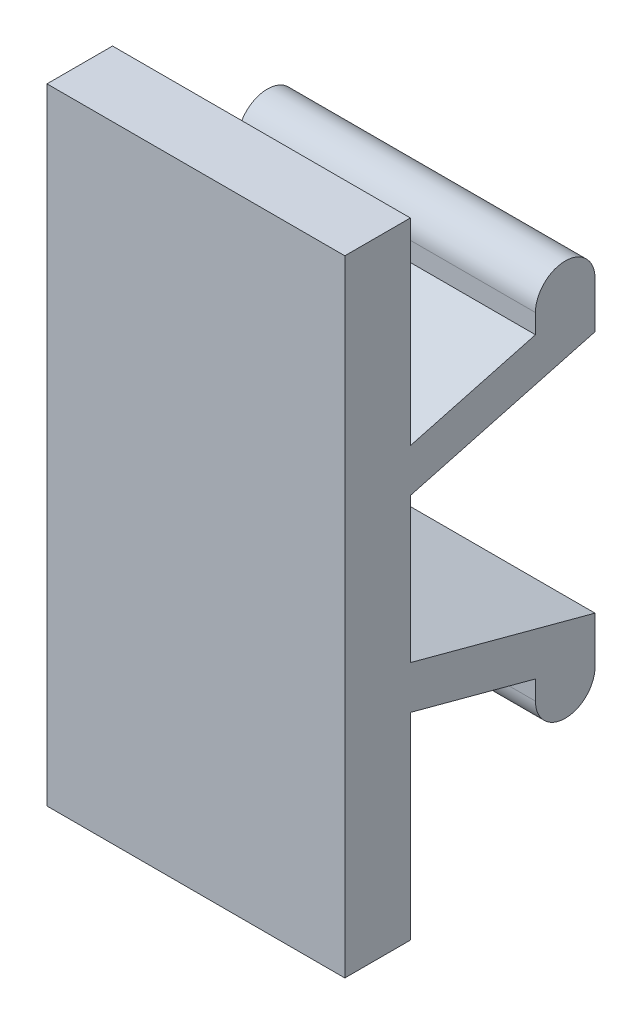
ISO-10303-21;
HEADER;
FILE_DESCRIPTION(('STEP AP214'),'2;1');
FILE_NAME('part.step','',(''),(''),'','','');
FILE_SCHEMA(('AUTOMOTIVE_DESIGN { 1 0 10303 214 1 1 1 1 }'));
ENDSEC;
DATA;
#1=APPLICATION_CONTEXT('core data for automotive mechanical design processes');
#2=APPLICATION_PROTOCOL_DEFINITION('international standard','automotive_design',2000,#1);
#3=PRODUCT_CONTEXT('',#1,'mechanical');
#4=PRODUCT('Part','Part','',(#3));
#5=PRODUCT_RELATED_PRODUCT_CATEGORY('part','',(#4));
#6=PRODUCT_DEFINITION_FORMATION('','',#4);
#7=PRODUCT_DEFINITION_CONTEXT('part definition',#1,'design');
#8=PRODUCT_DEFINITION('design','',#6,#7);
#9=PRODUCT_DEFINITION_SHAPE('','',#8);
#10=(LENGTH_UNIT() NAMED_UNIT(*) SI_UNIT(.MILLI.,.METRE.));
#11=(NAMED_UNIT(*) PLANE_ANGLE_UNIT() SI_UNIT($,.RADIAN.));
#12=(NAMED_UNIT(*) SI_UNIT($,.STERADIAN.) SOLID_ANGLE_UNIT());
#13=UNCERTAINTY_MEASURE_WITH_UNIT(LENGTH_MEASURE(1.E-05),#10,'distance_accuracy_value','');
#14=(GEOMETRIC_REPRESENTATION_CONTEXT(3) GLOBAL_UNCERTAINTY_ASSIGNED_CONTEXT((#13)) GLOBAL_UNIT_ASSIGNED_CONTEXT((#10,
#11,#12)) REPRESENTATION_CONTEXT('',''));
#15=CARTESIAN_POINT('',(0.,0.,0.));
#16=DIRECTION('',(0.,0.,1.));
#17=DIRECTION('',(1.,0.,0.));
#18=AXIS2_PLACEMENT_3D('',#15,#16,#17);
#19=CARTESIAN_POINT('',(-4.21537804662364E-13,-70.2839421184865,-13.5703289008152));
#20=DIRECTION('',(-1.,0.,0.));
#21=DIRECTION('',(0.,-0.707106781186548,-0.707106781186547));
#22=AXIS2_PLACEMENT_3D('',#19,#20,#21);
#23=PLANE('',#22);
#24=DIRECTION('',(0.,-0.258819045104797,-0.965925826288459));
#25=VECTOR('',#24,1.);
#26=CARTESIAN_POINT('',(-4.21537804662364E-13,-15.7645761699215,-68.0896948493802));
#27=LINE('',#26,#25);
#28=CARTESIAN_POINT('',(-4.21537804662364E-13,3.31064507456784,3.10000000000041));
#29=VERTEX_POINT('',#28);
#30=CARTESIAN_POINT('',(-4.21537804662364E-13,2.74795177045711,1.00000000000012));
#31=VERTEX_POINT('',#30);
#32=EDGE_CURVE('E205',#29,#31,#27,.T.);
#33=ORIENTED_EDGE('',*,*,#32,.F.);
#34=DIRECTION('',(0.,-1.,0.));
#35=VECTOR('',#34,1.);
#36=CARTESIAN_POINT('',(-4.21537804662364E-13,-53.6136132176709,3.10000000000043));
#37=LINE('',#36,#35);
#38=CARTESIAN_POINT('',(-4.21537804662364E-13,-4.92661467177413E-13,3.10000000000041));
#39=VERTEX_POINT('',#38);
#40=EDGE_CURVE('E283',#29,#39,#37,.T.);
#41=ORIENTED_EDGE('',*,*,#40,.T.);
#42=DIRECTION('',(0.,0.,1.));
#43=VECTOR('',#42,1.);
#44=CARTESIAN_POINT('',(-4.21537804662364E-13,-7.49400541621981E-13,-83.854271019301));
#45=LINE('',#44,#43);
#46=CARTESIAN_POINT('',(-4.21537804662364E-13,-4.85722573273506E-13,4.20000000000026));
#47=VERTEX_POINT('',#46);
#48=EDGE_CURVE('E296',#39,#47,#45,.T.);
#49=ORIENTED_EDGE('',*,*,#48,.T.);
#50=DIRECTION('',(0.,1.,0.));
#51=VECTOR('',#50,1.);
#52=CARTESIAN_POINT('',(-4.21537804662364E-13,-52.513613217671,4.20000000000034));
#53=LINE('',#52,#51);
#54=CARTESIAN_POINT('',(-4.21537804662364E-13,10.4999999999994,4.20000000000025));
#55=VERTEX_POINT('',#54);
#56=EDGE_CURVE('E195',#47,#55,#53,.T.);
#57=ORIENTED_EDGE('',*,*,#56,.T.);
#58=DIRECTION('',(0.,0.,1.));
#59=VECTOR('',#58,1.);
#60=CARTESIAN_POINT('',(-4.21537804662364E-13,10.4999999999996,-94.3542710193014));
#61=LINE('',#60,#59);
#62=CARTESIAN_POINT('',(-4.21537804662364E-13,10.4999999999994,3.10000000000041));
#63=VERTEX_POINT('',#62);
#64=EDGE_CURVE('E187',#63,#55,#61,.T.);
#65=ORIENTED_EDGE('',*,*,#64,.F.);
#66=DIRECTION('',(0.,-1.,0.));
#67=VECTOR('',#66,1.);
#68=CARTESIAN_POINT('',(-4.21537804662364E-13,-53.6136132176709,3.10000000000043));
#69=LINE('',#68,#67);
#70=CARTESIAN_POINT('',(-4.21537804662364E-13,7.18935492542956,3.1000000000004));
#71=VERTEX_POINT('',#70);
#72=EDGE_CURVE('E154',#63,#71,#69,.T.);
#73=ORIENTED_EDGE('',*,*,#72,.T.);
#74=DIRECTION('',(0.,-0.258819045105016,0.9659258262884));
#75=VECTOR('',#74,1.);
#76=CARTESIAN_POINT('',(-4.21537804662364E-13,-5.65982413375175,51.0537890839195));
#77=LINE('',#76,#75);
#78=CARTESIAN_POINT('',(-4.21537804662364E-13,7.75204822954077,1.00000000000005));
#79=VERTEX_POINT('',#78);
#80=EDGE_CURVE('E133',#79,#71,#77,.T.);
#81=ORIENTED_EDGE('',*,*,#80,.F.);
#82=DIRECTION('',(0.,-1.,0.));
#83=VECTOR('',#82,1.);
#84=CARTESIAN_POINT('',(-4.21537804662364E-13,-55.7136132176712,1.00000000000013));
#85=LINE('',#84,#83);
#86=CARTESIAN_POINT('',(-4.21537804662364E-13,8.07499999999913,1.00000000000006));
#87=VERTEX_POINT('',#86);
#88=EDGE_CURVE('E146',#87,#79,#85,.T.);
#89=ORIENTED_EDGE('',*,*,#88,.F.);
#90=CARTESIAN_POINT('',(-4.21537804662364E-13,8.07499999999919,0.500000000000085));
#91=DIRECTION('',(-1.,0.,0.));
#92=DIRECTION('',(0.,0.,-1.));
#93=AXIS2_PLACEMENT_3D('',#90,#91,#92);
#94=CIRCLE('',#93,0.500000000000199);
#95=CARTESIAN_POINT('',(-4.21537804662364E-13,8.07499999999913,-1.64798730217797E-13));
#96=VERTEX_POINT('',#95);
#97=EDGE_CURVE('E150',#87,#96,#94,.T.);
#98=ORIENTED_EDGE('',*,*,#97,.T.);
#99=DIRECTION('',(0.,-1.,0.));
#100=VECTOR('',#99,1.);
#101=CARTESIAN_POINT('',(-4.21537804662364E-13,-56.7136132176712,1.28369537222284E-13));
#102=LINE('',#101,#100);
#103=CARTESIAN_POINT('',(-4.21537804662364E-13,7.29530409568387,1.196959198424E-13));
#104=VERTEX_POINT('',#103);
#105=EDGE_CURVE('E212',#96,#104,#102,.T.);
#106=ORIENTED_EDGE('',*,*,#105,.T.);
#107=DIRECTION('',(0.,-0.258819045104021,0.965925826288666));
#108=VECTOR('',#107,1.);
#109=CARTESIAN_POINT('',(-4.21537804662364E-13,-6.23137174035895,50.4822414773123));
#110=LINE('',#109,#108);
#111=CARTESIAN_POINT('',(-4.21537804662364E-13,6.46466159914211,3.10000000000041));
#112=VERTEX_POINT('',#111);
#113=EDGE_CURVE('E11',#104,#112,#110,.T.);
#114=ORIENTED_EDGE('',*,*,#113,.T.);
#115=DIRECTION('',(0.,-1.,0.));
#116=VECTOR('',#115,1.);
#117=CARTESIAN_POINT('',(-4.21537804662364E-13,-53.6136132176709,3.10000000000043));
#118=LINE('',#117,#116);
#119=CARTESIAN_POINT('',(-4.21537804662364E-13,4.03533840085481,3.10000000000033));
#120=VERTEX_POINT('',#119);
#121=EDGE_CURVE('E261',#112,#120,#118,.T.);
#122=ORIENTED_EDGE('',*,*,#121,.T.);
#123=DIRECTION('',(0.,-0.258819045103512,-0.965925826288803));
#124=VECTOR('',#123,1.);
#125=CARTESIAN_POINT('',(-4.21537804662364E-13,-15.1930285631926,-68.6612424561092));
#126=LINE('',#125,#124);
#127=CARTESIAN_POINT('',(-4.21537804662364E-13,3.20469590431488,0.));
#128=VERTEX_POINT('',#127);
#129=EDGE_CURVE('E260',#120,#128,#126,.T.);
#130=ORIENTED_EDGE('',*,*,#129,.T.);
#131=DIRECTION('',(0.,-1.,0.));
#132=VECTOR('',#131,1.);
#133=CARTESIAN_POINT('',(-4.21537804662364E-13,-56.7136132176712,1.28369537222284E-13));
#134=LINE('',#133,#132);
#135=CARTESIAN_POINT('',(-4.21537804662364E-13,2.42499999999941,1.16226472890446E-13));
#136=VERTEX_POINT('',#135);
#137=EDGE_CURVE('E200',#128,#136,#134,.T.);
#138=ORIENTED_EDGE('',*,*,#137,.T.);
#139=CARTESIAN_POINT('',(-4.21537804662364E-13,2.42499999999933,0.500000000000089));
#140=DIRECTION('',(-1.,0.,0.));
#141=DIRECTION('',(0.,0.,-1.));
#142=AXIS2_PLACEMENT_3D('',#139,#140,#141);
#143=CIRCLE('',#142,0.5);
#144=CARTESIAN_POINT('',(-4.21537804662364E-13,2.4249999999994,1.00000000000005));
#145=VERTEX_POINT('',#144);
#146=EDGE_CURVE('E230',#136,#145,#143,.T.);
#147=ORIENTED_EDGE('',*,*,#146,.T.);
#148=DIRECTION('',(0.,-1.,0.));
#149=VECTOR('',#148,1.);
#150=CARTESIAN_POINT('',(-4.21537804662364E-13,-55.7136132176712,1.00000000000013));
#151=LINE('',#150,#149);
#152=EDGE_CURVE('E307',#31,#145,#151,.T.);
#153=ORIENTED_EDGE('',*,*,#152,.F.);
#154=EDGE_LOOP('',(#33,#41,#49,#57,#65,#73,#81,#89,#98,#106,#114,#122,#130,#138,#147,#153));
#155=FACE_BOUND('',#154,.T.);
#156=ADVANCED_FACE('F16',(#155),#23,.T.);
#157=CARTESIAN_POINT('',(4.9999999999996,-70.2839421184865,-13.5703289008152));
#158=DIRECTION('',(-1.,0.,0.));
#159=DIRECTION('',(0.,-0.707106781186548,-0.707106781186547));
#160=AXIS2_PLACEMENT_3D('',#157,#158,#159);
#161=PLANE('',#160);
#162=DIRECTION('',(0.,-1.,0.));
#163=VECTOR('',#162,1.);
#164=CARTESIAN_POINT('',(4.9999999999996,-55.7136132176712,1.00000000000013));
#165=LINE('',#164,#163);
#166=CARTESIAN_POINT('',(4.9999999999996,2.74795177045711,1.00000000000012));
#167=VERTEX_POINT('',#166);
#168=CARTESIAN_POINT('',(4.9999999999996,2.4249999999994,1.00000000000005));
#169=VERTEX_POINT('',#168);
#170=EDGE_CURVE('E238',#167,#169,#165,.T.);
#171=ORIENTED_EDGE('',*,*,#170,.T.);
#172=CARTESIAN_POINT('',(4.9999999999996,2.42499999999933,0.500000000000089));
#173=DIRECTION('',(-1.,0.,0.));
#174=DIRECTION('',(0.,0.,-1.));
#175=AXIS2_PLACEMENT_3D('',#172,#173,#174);
#176=CIRCLE('',#175,0.5);
#177=CARTESIAN_POINT('',(4.9999999999996,2.42499999999941,1.16226472890446E-13));
#178=VERTEX_POINT('',#177);
#179=EDGE_CURVE('E191',#178,#169,#176,.T.);
#180=ORIENTED_EDGE('',*,*,#179,.F.);
#181=DIRECTION('',(0.,-1.,0.));
#182=VECTOR('',#181,1.);
#183=CARTESIAN_POINT('',(4.9999999999996,-56.7136132176712,1.28369537222284E-13));
#184=LINE('',#183,#182);
#185=CARTESIAN_POINT('',(4.9999999999996,3.20469590431488,0.));
#186=VERTEX_POINT('',#185);
#187=EDGE_CURVE('E197',#186,#178,#184,.T.);
#188=ORIENTED_EDGE('',*,*,#187,.F.);
#189=DIRECTION('',(0.,-0.258819045103512,-0.965925826288803));
#190=VECTOR('',#189,1.);
#191=CARTESIAN_POINT('',(4.9999999999996,-15.1930285631926,-68.6612424561092));
#192=LINE('',#191,#190);
#193=CARTESIAN_POINT('',(4.9999999999996,4.03533840085481,3.10000000000033));
#194=VERTEX_POINT('',#193);
#195=EDGE_CURVE('E259',#194,#186,#192,.T.);
#196=ORIENTED_EDGE('',*,*,#195,.F.);
#197=DIRECTION('',(0.,-1.,0.));
#198=VECTOR('',#197,1.);
#199=CARTESIAN_POINT('',(4.9999999999996,-53.6136132176709,3.10000000000043));
#200=LINE('',#199,#198);
#201=CARTESIAN_POINT('',(4.9999999999996,6.46466159914211,3.10000000000041));
#202=VERTEX_POINT('',#201);
#203=EDGE_CURVE('E190',#202,#194,#200,.T.);
#204=ORIENTED_EDGE('',*,*,#203,.F.);
#205=DIRECTION('',(0.,-0.258819045104021,0.965925826288666));
#206=VECTOR('',#205,1.);
#207=CARTESIAN_POINT('',(4.9999999999996,-6.23137174035895,50.4822414773123));
#208=LINE('',#207,#206);
#209=CARTESIAN_POINT('',(4.9999999999996,7.29530409568387,1.196959198424E-13));
#210=VERTEX_POINT('',#209);
#211=EDGE_CURVE('E26',#210,#202,#208,.T.);
#212=ORIENTED_EDGE('',*,*,#211,.F.);
#213=DIRECTION('',(0.,-1.,0.));
#214=VECTOR('',#213,1.);
#215=CARTESIAN_POINT('',(4.9999999999996,-56.7136132176712,1.28369537222284E-13));
#216=LINE('',#215,#214);
#217=CARTESIAN_POINT('',(4.9999999999996,8.07499999999913,-1.64798730217797E-13));
#218=VERTEX_POINT('',#217);
#219=EDGE_CURVE('E213',#218,#210,#216,.T.);
#220=ORIENTED_EDGE('',*,*,#219,.F.);
#221=CARTESIAN_POINT('',(4.9999999999996,8.07499999999919,0.500000000000085));
#222=DIRECTION('',(-1.,0.,0.));
#223=DIRECTION('',(0.,0.,-1.));
#224=AXIS2_PLACEMENT_3D('',#221,#222,#223);
#225=CIRCLE('',#224,0.500000000000199);
#226=CARTESIAN_POINT('',(4.9999999999996,8.07499999999913,1.00000000000006));
#227=VERTEX_POINT('',#226);
#228=EDGE_CURVE('E165',#227,#218,#225,.T.);
#229=ORIENTED_EDGE('',*,*,#228,.F.);
#230=DIRECTION('',(0.,-1.,0.));
#231=VECTOR('',#230,1.);
#232=CARTESIAN_POINT('',(4.9999999999996,-55.7136132176712,1.00000000000013));
#233=LINE('',#232,#231);
#234=CARTESIAN_POINT('',(4.9999999999996,7.75204822954077,1.00000000000005));
#235=VERTEX_POINT('',#234);
#236=EDGE_CURVE('E155',#227,#235,#233,.T.);
#237=ORIENTED_EDGE('',*,*,#236,.T.);
#238=DIRECTION('',(0.,-0.258819045105016,0.9659258262884));
#239=VECTOR('',#238,1.);
#240=CARTESIAN_POINT('',(4.9999999999996,-5.65982413375175,51.0537890839195));
#241=LINE('',#240,#239);
#242=CARTESIAN_POINT('',(4.9999999999996,7.18935492542956,3.1000000000004));
#243=VERTEX_POINT('',#242);
#244=EDGE_CURVE('E306',#235,#243,#241,.T.);
#245=ORIENTED_EDGE('',*,*,#244,.T.);
#246=DIRECTION('',(0.,-1.,0.));
#247=VECTOR('',#246,1.);
#248=CARTESIAN_POINT('',(4.9999999999996,-53.6136132176709,3.10000000000043));
#249=LINE('',#248,#247);
#250=CARTESIAN_POINT('',(4.9999999999996,10.4999999999995,3.10000000000033));
#251=VERTEX_POINT('',#250);
#252=EDGE_CURVE('E201',#251,#243,#249,.T.);
#253=ORIENTED_EDGE('',*,*,#252,.F.);
#254=DIRECTION('',(0.,0.,1.));
#255=VECTOR('',#254,1.);
#256=CARTESIAN_POINT('',(4.9999999999996,10.4999999999996,-94.3542710193014));
#257=LINE('',#256,#255);
#258=CARTESIAN_POINT('',(4.9999999999996,10.4999999999994,4.20000000000025));
#259=VERTEX_POINT('',#258);
#260=EDGE_CURVE('E223',#251,#259,#257,.T.);
#261=ORIENTED_EDGE('',*,*,#260,.T.);
#262=DIRECTION('',(0.,1.,0.));
#263=VECTOR('',#262,1.);
#264=CARTESIAN_POINT('',(4.9999999999996,-52.513613217671,4.20000000000034));
#265=LINE('',#264,#263);
#266=CARTESIAN_POINT('',(4.9999999999996,-4.85722573273506E-13,4.20000000000026));
#267=VERTEX_POINT('',#266);
#268=EDGE_CURVE('E254',#267,#259,#265,.T.);
#269=ORIENTED_EDGE('',*,*,#268,.F.);
#270=DIRECTION('',(0.,0.,1.));
#271=VECTOR('',#270,1.);
#272=CARTESIAN_POINT('',(4.9999999999996,-7.49400541621981E-13,-83.854271019301));
#273=LINE('',#272,#271);
#274=CARTESIAN_POINT('',(4.9999999999996,-4.92661467177413E-13,3.10000000000041));
#275=VERTEX_POINT('',#274);
#276=EDGE_CURVE('E179',#275,#267,#273,.T.);
#277=ORIENTED_EDGE('',*,*,#276,.F.);
#278=DIRECTION('',(0.,-1.,0.));
#279=VECTOR('',#278,1.);
#280=CARTESIAN_POINT('',(4.9999999999996,-53.6136132176709,3.10000000000043));
#281=LINE('',#280,#279);
#282=CARTESIAN_POINT('',(4.9999999999996,3.31064507456784,3.10000000000041));
#283=VERTEX_POINT('',#282);
#284=EDGE_CURVE('E266',#283,#275,#281,.T.);
#285=ORIENTED_EDGE('',*,*,#284,.F.);
#286=DIRECTION('',(0.,-0.258819045104797,-0.965925826288459));
#287=VECTOR('',#286,1.);
#288=CARTESIAN_POINT('',(4.9999999999996,-15.7645761699215,-68.0896948493802));
#289=LINE('',#288,#287);
#290=EDGE_CURVE('E208',#283,#167,#289,.T.);
#291=ORIENTED_EDGE('',*,*,#290,.T.);
#292=EDGE_LOOP('',(#171,#180,#188,#196,#204,#212,#220,#229,#237,#245,#253,#261,#269,#277,#285,#291));
#293=FACE_BOUND('',#292,.T.);
#294=ADVANCED_FACE('F363',(#293),#161,.F.);
#295=CARTESIAN_POINT('',(-4.21537804662364E-13,7.17614479269718,0.444708572938114));
#296=DIRECTION('',(0.,-0.965925826288666,-0.258819045104021));
#297=DIRECTION('',(1.,0.,0.));
#298=AXIS2_PLACEMENT_3D('',#295,#296,#297);
#299=PLANE('',#298);
#300=DIRECTION('',(-1.,0.,0.));
#301=VECTOR('',#300,1.);
#302=CARTESIAN_POINT('',(-4.21537804662364E-13,7.2953040956838,0.));
#303=LINE('',#302,#301);
#304=EDGE_CURVE('E217',#210,#104,#303,.T.);
#305=ORIENTED_EDGE('',*,*,#304,.F.);
#306=ORIENTED_EDGE('',*,*,#211,.T.);
#307=DIRECTION('',(1.,0.,0.));
#308=VECTOR('',#307,1.);
#309=CARTESIAN_POINT('',(-4.21537804662364E-13,6.46466159914211,3.10000000000041));
#310=LINE('',#309,#308);
#311=EDGE_CURVE('E222',#112,#202,#310,.T.);
#312=ORIENTED_EDGE('',*,*,#311,.F.);
#313=ORIENTED_EDGE('',*,*,#113,.F.);
#314=EDGE_LOOP('',(#305,#306,#312,#313));
#315=FACE_BOUND('',#314,.T.);
#316=ADVANCED_FACE('F527',(#315),#299,.T.);
#317=CARTESIAN_POINT('',(-4.21537804662364E-13,6.31119620154537,3.10000000000033));
#318=DIRECTION('',(0.,0.,-1.));
#319=DIRECTION('',(0.,-1.,0.));
#320=AXIS2_PLACEMENT_3D('',#317,#318,#319);
#321=PLANE('',#320);
#322=ORIENTED_EDGE('',*,*,#121,.F.);
#323=ORIENTED_EDGE('',*,*,#311,.T.);
#324=ORIENTED_EDGE('',*,*,#203,.T.);
#325=DIRECTION('',(-1.,0.,0.));
#326=VECTOR('',#325,1.);
#327=CARTESIAN_POINT('',(-4.21537804662364E-13,4.03533840085481,3.10000000000033));
#328=LINE('',#327,#326);
#329=EDGE_CURVE('E255',#194,#120,#328,.T.);
#330=ORIENTED_EDGE('',*,*,#329,.T.);
#331=EDGE_LOOP('',(#322,#323,#324,#330));
#332=FACE_BOUND('',#331,.T.);
#333=ADVANCED_FACE('F532',(#332),#321,.T.);
#334=CARTESIAN_POINT('',(-4.21537804662364E-13,3.99561863319274,2.95176380902136));
#335=DIRECTION('',(0.,0.965925826288803,-0.258819045103512));
#336=DIRECTION('',(-1.,0.,0.));
#337=AXIS2_PLACEMENT_3D('',#334,#335,#336);
#338=PLANE('',#337);
#339=ORIENTED_EDGE('',*,*,#129,.F.);
#340=ORIENTED_EDGE('',*,*,#329,.F.);
#341=ORIENTED_EDGE('',*,*,#195,.T.);
#342=DIRECTION('',(-1.,0.,0.));
#343=VECTOR('',#342,1.);
#344=CARTESIAN_POINT('',(-4.21537804662364E-13,3.20469590431488,0.));
#345=LINE('',#344,#343);
#346=EDGE_CURVE('E183',#186,#128,#345,.T.);
#347=ORIENTED_EDGE('',*,*,#346,.T.);
#348=EDGE_LOOP('',(#339,#340,#341,#347));
#349=FACE_BOUND('',#348,.T.);
#350=ADVANCED_FACE('F592',(#349),#338,.T.);
#351=CARTESIAN_POINT('',(-4.21537804662364E-13,8.07499999999913,1.16226472890446E-13));
#352=DIRECTION('',(0.,0.,-1.));
#353=DIRECTION('',(0.,-1.,0.));
#354=AXIS2_PLACEMENT_3D('',#351,#352,#353);
#355=PLANE('',#354);
#356=ORIENTED_EDGE('',*,*,#105,.F.);
#357=DIRECTION('',(1.,0.,0.));
#358=VECTOR('',#357,1.);
#359=CARTESIAN_POINT('',(-4.21537804662364E-13,8.07499999999913,1.16226472890446E-13));
#360=LINE('',#359,#358);
#361=EDGE_CURVE('E170',#96,#218,#360,.T.);
#362=ORIENTED_EDGE('',*,*,#361,.T.);
#363=ORIENTED_EDGE('',*,*,#219,.T.);
#364=ORIENTED_EDGE('',*,*,#304,.T.);
#365=EDGE_LOOP('',(#356,#362,#363,#364));
#366=FACE_BOUND('',#365,.T.);
#367=ADVANCED_FACE('F510',(#366),#355,.T.);
#368=CARTESIAN_POINT('',(-4.21537804662364E-13,2.74429971152718,1.196959198424E-13));
#369=DIRECTION('',(0.,0.,-1.));
#370=DIRECTION('',(0.,-1.,0.));
#371=AXIS2_PLACEMENT_3D('',#368,#369,#370);
#372=PLANE('',#371);
#373=ORIENTED_EDGE('',*,*,#346,.F.);
#374=ORIENTED_EDGE('',*,*,#187,.T.);
#375=DIRECTION('',(1.,0.,0.));
#376=VECTOR('',#375,1.);
#377=CARTESIAN_POINT('',(-4.21537804662364E-13,2.42499999999941,1.16226472890446E-13));
#378=LINE('',#377,#376);
#379=EDGE_CURVE('E196',#136,#178,#378,.T.);
#380=ORIENTED_EDGE('',*,*,#379,.F.);
#381=ORIENTED_EDGE('',*,*,#137,.F.);
#382=EDGE_LOOP('',(#373,#374,#380,#381));
#383=FACE_BOUND('',#382,.T.);
#384=ADVANCED_FACE('F505',(#383),#372,.T.);
#385=CARTESIAN_POINT('',(-4.21537804662364E-13,0.199999999999353,4.20000000000027));
#386=DIRECTION('',(0.,0.,1.));
#387=DIRECTION('',(-1.,0.,0.));
#388=AXIS2_PLACEMENT_3D('',#385,#386,#387);
#389=PLANE('',#388);
#390=ORIENTED_EDGE('',*,*,#56,.F.);
#391=DIRECTION('',(1.,0.,0.));
#392=VECTOR('',#391,1.);
#393=CARTESIAN_POINT('',(-4.21537804662364E-13,-4.85722573273506E-13,4.20000000000026));
#394=LINE('',#393,#392);
#395=EDGE_CURVE('E172',#47,#267,#394,.T.);
#396=ORIENTED_EDGE('',*,*,#395,.T.);
#397=ORIENTED_EDGE('',*,*,#268,.T.);
#398=DIRECTION('',(-1.,0.,0.));
#399=VECTOR('',#398,1.);
#400=CARTESIAN_POINT('',(-4.21537804662364E-13,10.4999999999995,4.20000000000033));
#401=LINE('',#400,#399);
#402=EDGE_CURVE('E227',#259,#55,#401,.T.);
#403=ORIENTED_EDGE('',*,*,#402,.T.);
#404=EDGE_LOOP('',(#390,#396,#397,#403));
#405=FACE_BOUND('',#404,.T.);
#406=ADVANCED_FACE('F345',(#405),#389,.T.);
#407=CARTESIAN_POINT('',(-4.21537804662364E-13,2.42499999999933,0.500000000000089));
#408=DIRECTION('',(-1.,0.,0.));
#409=DIRECTION('',(0.,0.,-1.));
#410=AXIS2_PLACEMENT_3D('',#407,#408,#409);
#411=CYLINDRICAL_SURFACE('',#410,0.5);
#412=ORIENTED_EDGE('',*,*,#146,.F.);
#413=ORIENTED_EDGE('',*,*,#379,.T.);
#414=ORIENTED_EDGE('',*,*,#179,.T.);
#415=DIRECTION('',(1.,0.,0.));
#416=VECTOR('',#415,1.);
#417=CARTESIAN_POINT('',(-4.21537804662364E-13,2.4249999999994,1.00000000000005));
#418=LINE('',#417,#416);
#419=EDGE_CURVE('E247',#145,#169,#418,.T.);
#420=ORIENTED_EDGE('',*,*,#419,.F.);
#421=EDGE_LOOP('',(#412,#413,#414,#420));
#422=FACE_BOUND('',#421,.T.);
#423=ADVANCED_FACE('F323',(#422),#411,.T.);
#424=CARTESIAN_POINT('',(-4.21537804662364E-13,2.4249999999994,1.00000000000005));
#425=DIRECTION('',(0.,0.,1.));
#426=DIRECTION('',(-1.,0.,0.));
#427=AXIS2_PLACEMENT_3D('',#424,#425,#426);
#428=PLANE('',#427);
#429=ORIENTED_EDGE('',*,*,#152,.T.);
#430=ORIENTED_EDGE('',*,*,#419,.T.);
#431=ORIENTED_EDGE('',*,*,#170,.F.);
#432=DIRECTION('',(-1.,0.,0.));
#433=VECTOR('',#432,1.);
#434=CARTESIAN_POINT('',(-4.21537804662364E-13,2.74795177045711,1.00000000000012));
#435=LINE('',#434,#433);
#436=EDGE_CURVE('E300',#167,#31,#435,.T.);
#437=ORIENTED_EDGE('',*,*,#436,.T.);
#438=EDGE_LOOP('',(#429,#430,#431,#437));
#439=FACE_BOUND('',#438,.T.);
#440=ADVANCED_FACE('F321',(#439),#428,.T.);
#441=CARTESIAN_POINT('',(-4.21537804662364E-13,7.2568148347403,2.84823619098146));
#442=DIRECTION('',(0.,0.9659258262884,0.258819045105016));
#443=DIRECTION('',(-1.,0.,0.));
#444=AXIS2_PLACEMENT_3D('',#441,#442,#443);
#445=PLANE('',#444);
#446=ORIENTED_EDGE('',*,*,#80,.T.);
#447=DIRECTION('',(-1.,0.,0.));
#448=VECTOR('',#447,1.);
#449=CARTESIAN_POINT('',(-4.21537804662364E-13,7.18935492542956,3.1000000000004));
#450=LINE('',#449,#448);
#451=EDGE_CURVE('E19',#243,#71,#450,.T.);
#452=ORIENTED_EDGE('',*,*,#451,.F.);
#453=ORIENTED_EDGE('',*,*,#244,.F.);
#454=DIRECTION('',(-1.,0.,0.));
#455=VECTOR('',#454,1.);
#456=CARTESIAN_POINT('',(-4.21537804662364E-13,7.75204822954086,1.00000000000012));
#457=LINE('',#456,#455);
#458=EDGE_CURVE('E269',#235,#79,#457,.T.);
#459=ORIENTED_EDGE('',*,*,#458,.T.);
#460=EDGE_LOOP('',(#446,#452,#453,#459));
#461=FACE_BOUND('',#460,.T.);
#462=ADVANCED_FACE('F364',(#461),#445,.T.);
#463=CARTESIAN_POINT('',(-4.21537804662364E-13,2.80753142195099,1.22235428647044));
#464=DIRECTION('',(0.,-0.965925826288459,0.258819045104797));
#465=DIRECTION('',(1.,0.,0.));
#466=AXIS2_PLACEMENT_3D('',#463,#464,#465);
#467=PLANE('',#466);
#468=ORIENTED_EDGE('',*,*,#436,.F.);
#469=ORIENTED_EDGE('',*,*,#290,.F.);
#470=DIRECTION('',(1.,0.,0.));
#471=VECTOR('',#470,1.);
#472=CARTESIAN_POINT('',(-4.21537804662364E-13,3.31064507456784,3.10000000000041));
#473=LINE('',#472,#471);
#474=EDGE_CURVE('E270',#29,#283,#473,.T.);
#475=ORIENTED_EDGE('',*,*,#474,.F.);
#476=ORIENTED_EDGE('',*,*,#32,.T.);
#477=EDGE_LOOP('',(#468,#469,#475,#476));
#478=FACE_BOUND('',#477,.T.);
#479=ADVANCED_FACE('F462',(#478),#467,.T.);
#480=CARTESIAN_POINT('',(-4.21537804662364E-13,10.2999999999994,3.10000000000033));
#481=DIRECTION('',(0.,0.,-1.));
#482=DIRECTION('',(0.,-1.,0.));
#483=AXIS2_PLACEMENT_3D('',#480,#481,#482);
#484=PLANE('',#483);
#485=ORIENTED_EDGE('',*,*,#72,.F.);
#486=DIRECTION('',(-1.,0.,0.));
#487=VECTOR('',#486,1.);
#488=CARTESIAN_POINT('',(-4.21537804662364E-13,10.4999999999994,3.10000000000041));
#489=LINE('',#488,#487);
#490=EDGE_CURVE('E226',#251,#63,#489,.T.);
#491=ORIENTED_EDGE('',*,*,#490,.F.);
#492=ORIENTED_EDGE('',*,*,#252,.T.);
#493=ORIENTED_EDGE('',*,*,#451,.T.);
#494=EDGE_LOOP('',(#485,#491,#492,#493));
#495=FACE_BOUND('',#494,.T.);
#496=ADVANCED_FACE('F367',(#495),#484,.T.);
#497=CARTESIAN_POINT('',(-4.21537804662364E-13,7.98224632593297,1.00000000000012));
#498=DIRECTION('',(0.,0.,1.));
#499=DIRECTION('',(-1.,0.,0.));
#500=AXIS2_PLACEMENT_3D('',#497,#498,#499);
#501=PLANE('',#500);
#502=ORIENTED_EDGE('',*,*,#458,.F.);
#503=ORIENTED_EDGE('',*,*,#236,.F.);
#504=DIRECTION('',(1.,0.,0.));
#505=VECTOR('',#504,1.);
#506=CARTESIAN_POINT('',(-4.21537804662364E-13,8.07499999999913,1.00000000000006));
#507=LINE('',#506,#505);
#508=EDGE_CURVE('E158',#87,#227,#507,.T.);
#509=ORIENTED_EDGE('',*,*,#508,.F.);
#510=ORIENTED_EDGE('',*,*,#88,.T.);
#511=EDGE_LOOP('',(#502,#503,#509,#510));
#512=FACE_BOUND('',#511,.T.);
#513=ADVANCED_FACE('F159',(#512),#501,.T.);
#514=CARTESIAN_POINT('',(-4.21537804662364E-13,3.04999999999814,3.10000000000041));
#515=DIRECTION('',(0.,0.,-1.));
#516=DIRECTION('',(0.,-1.,0.));
#517=AXIS2_PLACEMENT_3D('',#514,#515,#516);
#518=PLANE('',#517);
#519=ORIENTED_EDGE('',*,*,#40,.F.);
#520=ORIENTED_EDGE('',*,*,#474,.T.);
#521=ORIENTED_EDGE('',*,*,#284,.T.);
#522=DIRECTION('',(-1.,0.,0.));
#523=VECTOR('',#522,1.);
#524=CARTESIAN_POINT('',(-4.21537804662364E-13,-4.92661467177413E-13,3.10000000000041));
#525=LINE('',#524,#523);
#526=EDGE_CURVE('E292',#275,#39,#525,.T.);
#527=ORIENTED_EDGE('',*,*,#526,.T.);
#528=EDGE_LOOP('',(#519,#520,#521,#527));
#529=FACE_BOUND('',#528,.T.);
#530=ADVANCED_FACE('F478',(#529),#518,.T.);
#531=CARTESIAN_POINT('',(-4.21537804662364E-13,10.4999999999995,4.00000000000034));
#532=DIRECTION('',(0.,1.,0.));
#533=DIRECTION('',(-1.,0.,0.));
#534=AXIS2_PLACEMENT_3D('',#531,#532,#533);
#535=PLANE('',#534);
#536=ORIENTED_EDGE('',*,*,#64,.T.);
#537=ORIENTED_EDGE('',*,*,#402,.F.);
#538=ORIENTED_EDGE('',*,*,#260,.F.);
#539=ORIENTED_EDGE('',*,*,#490,.T.);
#540=EDGE_LOOP('',(#536,#537,#538,#539));
#541=FACE_BOUND('',#540,.T.);
#542=ADVANCED_FACE('F350',(#541),#535,.T.);
#543=CARTESIAN_POINT('',(-4.21537804662364E-13,8.07499999999919,0.500000000000085));
#544=DIRECTION('',(-1.,0.,0.));
#545=DIRECTION('',(0.,0.,-1.));
#546=AXIS2_PLACEMENT_3D('',#543,#544,#545);
#547=CYLINDRICAL_SURFACE('',#546,0.500000000000199);
#548=ORIENTED_EDGE('',*,*,#97,.F.);
#549=ORIENTED_EDGE('',*,*,#508,.T.);
#550=ORIENTED_EDGE('',*,*,#228,.T.);
#551=ORIENTED_EDGE('',*,*,#361,.F.);
#552=EDGE_LOOP('',(#548,#549,#550,#551));
#553=FACE_BOUND('',#552,.T.);
#554=ADVANCED_FACE('F168',(#553),#547,.T.);
#555=CARTESIAN_POINT('',(-4.21537804662364E-13,-4.92661467177413E-13,3.30000000000025));
#556=DIRECTION('',(0.,-1.,0.));
#557=DIRECTION('',(1.,0.,0.));
#558=AXIS2_PLACEMENT_3D('',#555,#556,#557);
#559=PLANE('',#558);
#560=ORIENTED_EDGE('',*,*,#48,.F.);
#561=ORIENTED_EDGE('',*,*,#526,.F.);
#562=ORIENTED_EDGE('',*,*,#276,.T.);
#563=ORIENTED_EDGE('',*,*,#395,.F.);
#564=EDGE_LOOP('',(#560,#561,#562,#563));
#565=FACE_BOUND('',#564,.T.);
#566=ADVANCED_FACE('F373',(#565),#559,.T.);
#567=CLOSED_SHELL('',(#156,#294,#316,#333,#350,#367,#384,#406,#423,#440,#462,#479,#496,#513,
#530,#542,#554,#566));
#568=MANIFOLD_SOLID_BREP('B1',#567);
#569=ADVANCED_BREP_SHAPE_REPRESENTATION('',(#18,#568),#14);
#570=SHAPE_DEFINITION_REPRESENTATION(#9,#569);
ENDSEC;
END-ISO-10303-21;
